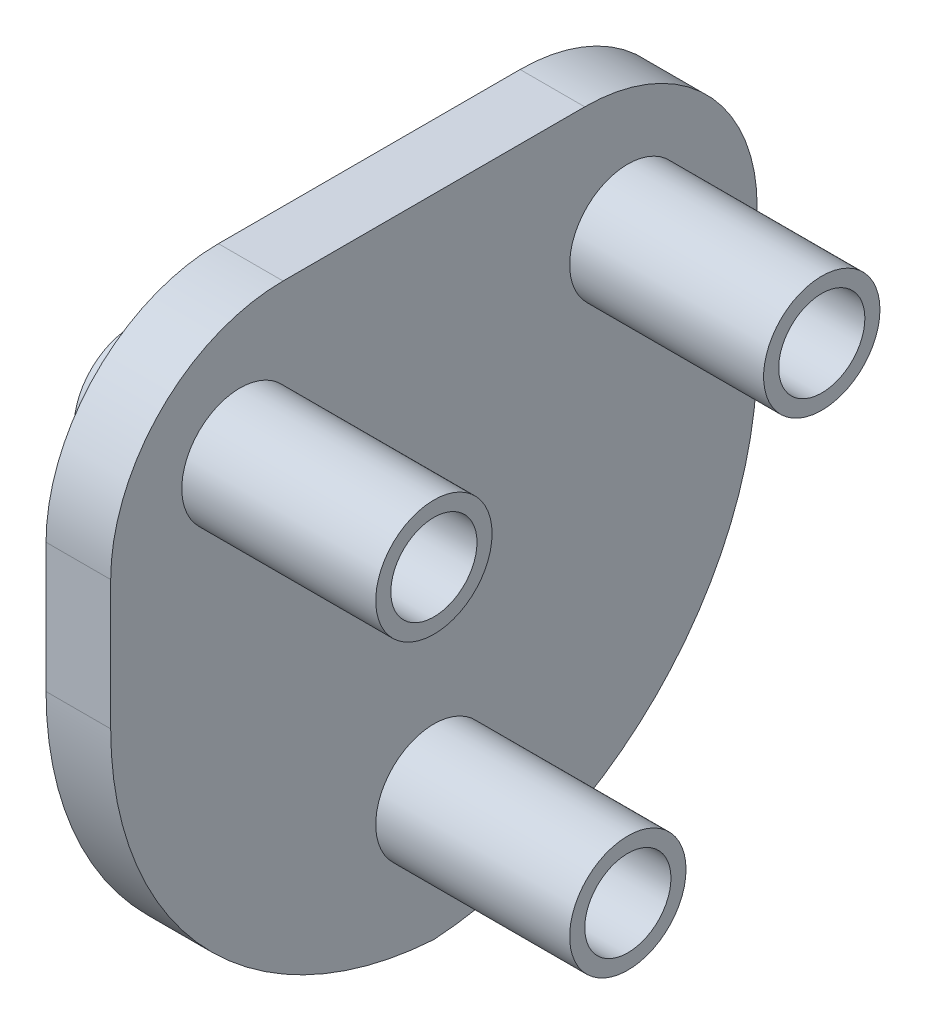
ISO-10303-21;
HEADER;
FILE_DESCRIPTION(('STEP AP214'),'2;1');
FILE_NAME('part.step','',(''),(''),'','','');
FILE_SCHEMA(('AUTOMOTIVE_DESIGN { 1 0 10303 214 1 1 1 1 }'));
ENDSEC;
DATA;
#1=APPLICATION_CONTEXT('core data for automotive mechanical design processes');
#2=APPLICATION_PROTOCOL_DEFINITION('international standard','automotive_design',2000,#1);
#3=PRODUCT_CONTEXT('',#1,'mechanical');
#4=PRODUCT('Part','Part','',(#3));
#5=PRODUCT_RELATED_PRODUCT_CATEGORY('part','',(#4));
#6=PRODUCT_DEFINITION_FORMATION('','',#4);
#7=PRODUCT_DEFINITION_CONTEXT('part definition',#1,'design');
#8=PRODUCT_DEFINITION('design','',#6,#7);
#9=PRODUCT_DEFINITION_SHAPE('','',#8);
#10=(LENGTH_UNIT() NAMED_UNIT(*) SI_UNIT(.MILLI.,.METRE.));
#11=(NAMED_UNIT(*) PLANE_ANGLE_UNIT() SI_UNIT($,.RADIAN.));
#12=(NAMED_UNIT(*) SI_UNIT($,.STERADIAN.) SOLID_ANGLE_UNIT());
#13=UNCERTAINTY_MEASURE_WITH_UNIT(LENGTH_MEASURE(1.E-05),#10,'distance_accuracy_value','');
#14=(GEOMETRIC_REPRESENTATION_CONTEXT(3) GLOBAL_UNCERTAINTY_ASSIGNED_CONTEXT((#13)) GLOBAL_UNIT_ASSIGNED_CONTEXT((#10,
#11,#12)) REPRESENTATION_CONTEXT('',''));
#15=CARTESIAN_POINT('',(0.,0.,0.));
#16=DIRECTION('',(0.,0.,1.));
#17=DIRECTION('',(1.,0.,0.));
#18=AXIS2_PLACEMENT_3D('',#15,#16,#17);
#19=CARTESIAN_POINT('',(-7.5,-75.,-75.));
#20=DIRECTION('',(-1.,0.,0.));
#21=DIRECTION('',(0.,0.,1.));
#22=AXIS2_PLACEMENT_3D('',#19,#20,#21);
#23=PLANE('',#22);
#24=CARTESIAN_POINT('',(-7.5,45.,-45.));
#25=DIRECTION('',(-1.,0.,0.));
#26=DIRECTION('',(0.,0.,1.));
#27=AXIS2_PLACEMENT_3D('',#24,#25,#26);
#28=CIRCLE('',#27,13.5);
#29=CARTESIAN_POINT('',(-7.5,45.,-31.5));
#30=VERTEX_POINT('',#29);
#31=EDGE_CURVE('E128',#30,#30,#28,.T.);
#32=ORIENTED_EDGE('',*,*,#31,.F.);
#33=EDGE_LOOP('',(#32));
#34=FACE_BOUND('',#33,.T.);
#35=CARTESIAN_POINT('',(-7.5,45.,45.));
#36=DIRECTION('',(-1.,0.,0.));
#37=DIRECTION('',(0.,0.,1.));
#38=AXIS2_PLACEMENT_3D('',#35,#36,#37);
#39=CIRCLE('',#38,13.5);
#40=CARTESIAN_POINT('',(-7.5,45.,58.5));
#41=VERTEX_POINT('',#40);
#42=EDGE_CURVE('E201',#41,#41,#39,.T.);
#43=ORIENTED_EDGE('',*,*,#42,.F.);
#44=EDGE_LOOP('',(#43));
#45=FACE_BOUND('',#44,.T.);
#46=CARTESIAN_POINT('',(-7.5,-45.,0.));
#47=DIRECTION('',(-1.,0.,0.));
#48=DIRECTION('',(0.,0.,1.));
#49=AXIS2_PLACEMENT_3D('',#46,#47,#48);
#50=CIRCLE('',#49,13.5);
#51=CARTESIAN_POINT('',(-7.5,-45.,13.5));
#52=VERTEX_POINT('',#51);
#53=EDGE_CURVE('E197',#52,#52,#50,.T.);
#54=ORIENTED_EDGE('',*,*,#53,.F.);
#55=EDGE_LOOP('',(#54));
#56=FACE_BOUND('',#55,.T.);
#57=DIRECTION('',(0.,0.,1.));
#58=VECTOR('',#57,1.);
#59=CARTESIAN_POINT('',(-7.5,75.,-75.));
#60=LINE('',#59,#58);
#61=CARTESIAN_POINT('',(-7.5,75.,-35.));
#62=VERTEX_POINT('',#61);
#63=CARTESIAN_POINT('',(-7.5,75.,35.));
#64=VERTEX_POINT('',#63);
#65=EDGE_CURVE('E179',#62,#64,#60,.T.);
#66=ORIENTED_EDGE('',*,*,#65,.F.);
#67=CARTESIAN_POINT('',(-7.5,35.,-35.));
#68=DIRECTION('',(-1.,0.,0.));
#69=DIRECTION('',(0.,0.,1.));
#70=AXIS2_PLACEMENT_3D('',#67,#68,#69);
#71=CIRCLE('',#70,40.);
#72=CARTESIAN_POINT('',(-7.5,35.,-75.));
#73=VERTEX_POINT('',#72);
#74=EDGE_CURVE('E160',#62,#73,#71,.T.);
#75=ORIENTED_EDGE('',*,*,#74,.T.);
#76=DIRECTION('',(0.,-1.,0.));
#77=VECTOR('',#76,1.);
#78=CARTESIAN_POINT('',(-7.5,-75.,-75.));
#79=LINE('',#78,#77);
#80=CARTESIAN_POINT('',(-7.5,5.,-75.));
#81=VERTEX_POINT('',#80);
#82=EDGE_CURVE('E120',#73,#81,#79,.T.);
#83=ORIENTED_EDGE('',*,*,#82,.T.);
#84=CARTESIAN_POINT('',(-7.5,5.,5.));
#85=DIRECTION('',(-1.,0.,0.));
#86=DIRECTION('',(0.,0.,1.));
#87=AXIS2_PLACEMENT_3D('',#84,#85,#86);
#88=CIRCLE('',#87,80.);
#89=CARTESIAN_POINT('',(-7.5,-74.8435971133566,0.));
#90=VERTEX_POINT('',#89);
#91=EDGE_CURVE('E114',#81,#90,#88,.T.);
#92=ORIENTED_EDGE('',*,*,#91,.T.);
#93=CARTESIAN_POINT('',(-7.5,5.,-5.));
#94=DIRECTION('',(-1.,0.,0.));
#95=DIRECTION('',(0.,0.,1.));
#96=AXIS2_PLACEMENT_3D('',#93,#94,#95);
#97=CIRCLE('',#96,80.);
#98=CARTESIAN_POINT('',(-7.5,5.,75.));
#99=VERTEX_POINT('',#98);
#100=EDGE_CURVE('E143',#90,#99,#97,.T.);
#101=ORIENTED_EDGE('',*,*,#100,.T.);
#102=DIRECTION('',(0.,-1.,0.));
#103=VECTOR('',#102,1.);
#104=CARTESIAN_POINT('',(-7.5,-75.,75.));
#105=LINE('',#104,#103);
#106=CARTESIAN_POINT('',(-7.5,35.,75.));
#107=VERTEX_POINT('',#106);
#108=EDGE_CURVE('E107',#107,#99,#105,.T.);
#109=ORIENTED_EDGE('',*,*,#108,.F.);
#110=CARTESIAN_POINT('',(-7.5,35.,35.));
#111=DIRECTION('',(-1.,0.,0.));
#112=DIRECTION('',(0.,0.,1.));
#113=AXIS2_PLACEMENT_3D('',#110,#111,#112);
#114=CIRCLE('',#113,40.);
#115=EDGE_CURVE('E157',#107,#64,#114,.T.);
#116=ORIENTED_EDGE('',*,*,#115,.T.);
#117=EDGE_LOOP('',(#66,#75,#83,#92,#101,#109,#116));
#118=FACE_BOUND('',#117,.T.);
#119=ADVANCED_FACE('F39',(#34,#45,#56,#118),#23,.T.);
#120=CARTESIAN_POINT('',(7.5,75.,-75.));
#121=DIRECTION('',(0.,1.,0.));
#122=DIRECTION('',(0.,0.,1.));
#123=AXIS2_PLACEMENT_3D('',#120,#121,#122);
#124=PLANE('',#123);
#125=DIRECTION('',(0.,0.,1.));
#126=VECTOR('',#125,1.);
#127=CARTESIAN_POINT('',(7.5,75.,-75.));
#128=LINE('',#127,#126);
#129=CARTESIAN_POINT('',(7.5,75.,-35.));
#130=VERTEX_POINT('',#129);
#131=CARTESIAN_POINT('',(7.5,75.,35.));
#132=VERTEX_POINT('',#131);
#133=EDGE_CURVE('E169',#130,#132,#128,.T.);
#134=ORIENTED_EDGE('',*,*,#133,.F.);
#135=DIRECTION('',(-1.,0.,0.));
#136=VECTOR('',#135,1.);
#137=CARTESIAN_POINT('',(-7.5,75.,-35.));
#138=LINE('',#137,#136);
#139=EDGE_CURVE('E153',#130,#62,#138,.T.);
#140=ORIENTED_EDGE('',*,*,#139,.T.);
#141=ORIENTED_EDGE('',*,*,#65,.T.);
#142=DIRECTION('',(-1.,0.,0.));
#143=VECTOR('',#142,1.);
#144=CARTESIAN_POINT('',(7.5,75.,35.));
#145=LINE('',#144,#143);
#146=EDGE_CURVE('E113',#64,#132,#145,.F.);
#147=ORIENTED_EDGE('',*,*,#146,.T.);
#148=EDGE_LOOP('',(#134,#140,#141,#147));
#149=FACE_BOUND('',#148,.T.);
#150=ADVANCED_FACE('F174',(#149),#124,.T.);
#151=CARTESIAN_POINT('',(7.5,-75.,-75.));
#152=DIRECTION('',(1.,0.,0.));
#153=DIRECTION('',(0.,0.,-1.));
#154=AXIS2_PLACEMENT_3D('',#151,#152,#153);
#155=PLANE('',#154);
#156=CARTESIAN_POINT('',(7.5,45.,-45.));
#157=DIRECTION('',(1.,0.,0.));
#158=DIRECTION('',(0.,0.,-1.));
#159=AXIS2_PLACEMENT_3D('',#156,#157,#158);
#160=CIRCLE('',#159,13.5);
#161=CARTESIAN_POINT('',(7.5,45.,-58.5));
#162=VERTEX_POINT('',#161);
#163=EDGE_CURVE('E135',#162,#162,#160,.T.);
#164=ORIENTED_EDGE('',*,*,#163,.F.);
#165=EDGE_LOOP('',(#164));
#166=FACE_BOUND('',#165,.T.);
#167=CARTESIAN_POINT('',(7.5,45.,45.));
#168=DIRECTION('',(1.,0.,0.));
#169=DIRECTION('',(0.,0.,-1.));
#170=AXIS2_PLACEMENT_3D('',#167,#168,#169);
#171=CIRCLE('',#170,13.5);
#172=CARTESIAN_POINT('',(7.5,45.,31.5));
#173=VERTEX_POINT('',#172);
#174=EDGE_CURVE('E198',#173,#173,#171,.T.);
#175=ORIENTED_EDGE('',*,*,#174,.F.);
#176=EDGE_LOOP('',(#175));
#177=FACE_BOUND('',#176,.T.);
#178=CARTESIAN_POINT('',(7.5,-45.,0.));
#179=DIRECTION('',(1.,0.,0.));
#180=DIRECTION('',(0.,0.,-1.));
#181=AXIS2_PLACEMENT_3D('',#178,#179,#180);
#182=CIRCLE('',#181,13.5);
#183=CARTESIAN_POINT('',(7.5,-45.,-13.5));
#184=VERTEX_POINT('',#183);
#185=EDGE_CURVE('E193',#184,#184,#182,.T.);
#186=ORIENTED_EDGE('',*,*,#185,.F.);
#187=EDGE_LOOP('',(#186));
#188=FACE_BOUND('',#187,.T.);
#189=DIRECTION('',(0.,1.,0.));
#190=VECTOR('',#189,1.);
#191=CARTESIAN_POINT('',(7.5,-75.,-75.));
#192=LINE('',#191,#190);
#193=CARTESIAN_POINT('',(7.5,5.,-75.));
#194=VERTEX_POINT('',#193);
#195=CARTESIAN_POINT('',(7.5,35.,-75.));
#196=VERTEX_POINT('',#195);
#197=EDGE_CURVE('E170',#194,#196,#192,.T.);
#198=ORIENTED_EDGE('',*,*,#197,.T.);
#199=CARTESIAN_POINT('',(7.5,35.,-35.));
#200=DIRECTION('',(1.,0.,0.));
#201=DIRECTION('',(0.,0.,-1.));
#202=AXIS2_PLACEMENT_3D('',#199,#200,#201);
#203=CIRCLE('',#202,40.);
#204=EDGE_CURVE('E48',#196,#130,#203,.T.);
#205=ORIENTED_EDGE('',*,*,#204,.T.);
#206=ORIENTED_EDGE('',*,*,#133,.T.);
#207=CARTESIAN_POINT('',(7.5,35.,35.));
#208=DIRECTION('',(1.,0.,0.));
#209=DIRECTION('',(0.,0.,-1.));
#210=AXIS2_PLACEMENT_3D('',#207,#208,#209);
#211=CIRCLE('',#210,40.);
#212=CARTESIAN_POINT('',(7.5,35.,75.));
#213=VERTEX_POINT('',#212);
#214=EDGE_CURVE('E55',#132,#213,#211,.T.);
#215=ORIENTED_EDGE('',*,*,#214,.T.);
#216=DIRECTION('',(0.,1.,0.));
#217=VECTOR('',#216,1.);
#218=CARTESIAN_POINT('',(7.5,-75.,75.));
#219=LINE('',#218,#217);
#220=CARTESIAN_POINT('',(7.5,5.,75.));
#221=VERTEX_POINT('',#220);
#222=EDGE_CURVE('E104',#221,#213,#219,.T.);
#223=ORIENTED_EDGE('',*,*,#222,.F.);
#224=CARTESIAN_POINT('',(7.5,5.,-5.));
#225=DIRECTION('',(1.,0.,0.));
#226=DIRECTION('',(0.,0.,-1.));
#227=AXIS2_PLACEMENT_3D('',#224,#225,#226);
#228=CIRCLE('',#227,80.);
#229=CARTESIAN_POINT('',(7.5,-74.8435971133566,0.));
#230=VERTEX_POINT('',#229);
#231=EDGE_CURVE('E117',#221,#230,#228,.T.);
#232=ORIENTED_EDGE('',*,*,#231,.T.);
#233=CARTESIAN_POINT('',(7.5,5.,5.));
#234=DIRECTION('',(1.,0.,0.));
#235=DIRECTION('',(0.,0.,-1.));
#236=AXIS2_PLACEMENT_3D('',#233,#234,#235);
#237=CIRCLE('',#236,80.);
#238=EDGE_CURVE('E127',#230,#194,#237,.T.);
#239=ORIENTED_EDGE('',*,*,#238,.T.);
#240=EDGE_LOOP('',(#198,#205,#206,#215,#223,#232,#239));
#241=FACE_BOUND('',#240,.T.);
#242=ADVANCED_FACE('F116',(#166,#177,#188,#241),#155,.T.);
#243=CARTESIAN_POINT('',(0.,0.,-75.));
#244=DIRECTION('',(0.,0.,1.));
#245=DIRECTION('',(1.,0.,0.));
#246=AXIS2_PLACEMENT_3D('',#243,#244,#245);
#247=PLANE('',#246);
#248=ORIENTED_EDGE('',*,*,#82,.F.);
#249=DIRECTION('',(-1.,0.,0.));
#250=VECTOR('',#249,1.);
#251=CARTESIAN_POINT('',(7.5,35.,-75.));
#252=LINE('',#251,#250);
#253=EDGE_CURVE('E63',#73,#196,#252,.F.);
#254=ORIENTED_EDGE('',*,*,#253,.T.);
#255=ORIENTED_EDGE('',*,*,#197,.F.);
#256=DIRECTION('',(1.,0.,0.));
#257=VECTOR('',#256,1.);
#258=CARTESIAN_POINT('',(-7.5,5.,-75.));
#259=LINE('',#258,#257);
#260=EDGE_CURVE('E132',#194,#81,#259,.F.);
#261=ORIENTED_EDGE('',*,*,#260,.T.);
#262=EDGE_LOOP('',(#248,#254,#255,#261));
#263=FACE_BOUND('',#262,.T.);
#264=ADVANCED_FACE('F184',(#263),#247,.F.);
#265=CARTESIAN_POINT('',(0.,0.,75.));
#266=DIRECTION('',(0.,0.,1.));
#267=DIRECTION('',(1.,0.,0.));
#268=AXIS2_PLACEMENT_3D('',#265,#266,#267);
#269=PLANE('',#268);
#270=ORIENTED_EDGE('',*,*,#222,.T.);
#271=DIRECTION('',(-1.,0.,0.));
#272=VECTOR('',#271,1.);
#273=CARTESIAN_POINT('',(0.,35.,75.));
#274=LINE('',#273,#272);
#275=EDGE_CURVE('E11',#213,#107,#274,.T.);
#276=ORIENTED_EDGE('',*,*,#275,.T.);
#277=ORIENTED_EDGE('',*,*,#108,.T.);
#278=DIRECTION('',(1.,0.,0.));
#279=VECTOR('',#278,1.);
#280=CARTESIAN_POINT('',(0.,5.,75.));
#281=LINE('',#280,#279);
#282=EDGE_CURVE('E102',#99,#221,#281,.T.);
#283=ORIENTED_EDGE('',*,*,#282,.T.);
#284=EDGE_LOOP('',(#270,#276,#277,#283));
#285=FACE_BOUND('',#284,.T.);
#286=ADVANCED_FACE('F103',(#285),#269,.T.);
#287=CARTESIAN_POINT('',(52.5,-45.,0.));
#288=DIRECTION('',(1.,0.,0.));
#289=DIRECTION('',(0.,0.,-1.));
#290=AXIS2_PLACEMENT_3D('',#287,#288,#289);
#291=PLANE('',#290);
#292=CARTESIAN_POINT('',(52.5,-45.,0.));
#293=DIRECTION('',(1.,0.,0.));
#294=DIRECTION('',(0.,0.,-1.));
#295=AXIS2_PLACEMENT_3D('',#292,#293,#294);
#296=CIRCLE('',#295,9.99999999999999);
#297=CARTESIAN_POINT('',(52.5,-45.,-9.99999999999999));
#298=VERTEX_POINT('',#297);
#299=EDGE_CURVE('E246',#298,#298,#296,.T.);
#300=ORIENTED_EDGE('',*,*,#299,.F.);
#301=EDGE_LOOP('',(#300));
#302=FACE_BOUND('',#301,.T.);
#303=CARTESIAN_POINT('',(52.5,-45.,0.));
#304=DIRECTION('',(1.,0.,0.));
#305=DIRECTION('',(0.,0.,-1.));
#306=AXIS2_PLACEMENT_3D('',#303,#304,#305);
#307=CIRCLE('',#306,13.5);
#308=CARTESIAN_POINT('',(52.5,-45.,-13.5));
#309=VERTEX_POINT('',#308);
#310=EDGE_CURVE('E218',#309,#309,#307,.T.);
#311=ORIENTED_EDGE('',*,*,#310,.T.);
#312=EDGE_LOOP('',(#311));
#313=FACE_BOUND('',#312,.T.);
#314=ADVANCED_FACE('F323',(#302,#313),#291,.T.);
#315=CARTESIAN_POINT('',(-17.5,-45.,0.));
#316=DIRECTION('',(1.,0.,0.));
#317=DIRECTION('',(0.,0.,-1.));
#318=AXIS2_PLACEMENT_3D('',#315,#316,#317);
#319=CYLINDRICAL_SURFACE('',#318,13.5);
#320=ORIENTED_EDGE('',*,*,#185,.T.);
#321=EDGE_LOOP('',(#320));
#322=FACE_BOUND('',#321,.T.);
#323=ORIENTED_EDGE('',*,*,#310,.F.);
#324=EDGE_LOOP('',(#323));
#325=FACE_BOUND('',#324,.T.);
#326=ADVANCED_FACE('F452',(#322,#325),#319,.T.);
#327=ORIENTED_EDGE('',*,*,#53,.T.);
#328=EDGE_LOOP('',(#327));
#329=FACE_BOUND('',#328,.T.);
#330=CARTESIAN_POINT('',(-17.5,-45.,0.));
#331=DIRECTION('',(1.,0.,0.));
#332=DIRECTION('',(0.,0.,-1.));
#333=AXIS2_PLACEMENT_3D('',#330,#331,#332);
#334=CIRCLE('',#333,13.5);
#335=CARTESIAN_POINT('',(-17.5,-45.,-13.5));
#336=VERTEX_POINT('',#335);
#337=EDGE_CURVE('E213',#336,#336,#334,.T.);
#338=ORIENTED_EDGE('',*,*,#337,.T.);
#339=EDGE_LOOP('',(#338));
#340=FACE_BOUND('',#339,.T.);
#341=ADVANCED_FACE('F442',(#329,#340),#319,.T.);
#342=CARTESIAN_POINT('',(-17.5,-45.,0.));
#343=DIRECTION('',(1.,0.,0.));
#344=DIRECTION('',(0.,0.,-1.));
#345=AXIS2_PLACEMENT_3D('',#342,#343,#344);
#346=PLANE('',#345);
#347=CARTESIAN_POINT('',(-17.5,-45.,0.));
#348=DIRECTION('',(1.,0.,0.));
#349=DIRECTION('',(0.,0.,-1.));
#350=AXIS2_PLACEMENT_3D('',#347,#348,#349);
#351=CIRCLE('',#350,9.99999999999999);
#352=CARTESIAN_POINT('',(-17.5,-45.,-9.99999999999999));
#353=VERTEX_POINT('',#352);
#354=EDGE_CURVE('E242',#353,#353,#351,.T.);
#355=ORIENTED_EDGE('',*,*,#354,.T.);
#356=EDGE_LOOP('',(#355));
#357=FACE_BOUND('',#356,.T.);
#358=ORIENTED_EDGE('',*,*,#337,.F.);
#359=EDGE_LOOP('',(#358));
#360=FACE_BOUND('',#359,.T.);
#361=ADVANCED_FACE('F272',(#357,#360),#346,.F.);
#362=CARTESIAN_POINT('',(52.5,45.,45.));
#363=DIRECTION('',(1.,0.,0.));
#364=DIRECTION('',(0.,0.,-1.));
#365=AXIS2_PLACEMENT_3D('',#362,#363,#364);
#366=PLANE('',#365);
#367=CARTESIAN_POINT('',(52.5,45.,45.));
#368=DIRECTION('',(1.,0.,0.));
#369=DIRECTION('',(0.,0.,-1.));
#370=AXIS2_PLACEMENT_3D('',#367,#368,#369);
#371=CIRCLE('',#370,9.99999999999999);
#372=CARTESIAN_POINT('',(52.5,45.,35.));
#373=VERTEX_POINT('',#372);
#374=EDGE_CURVE('E150',#373,#373,#371,.T.);
#375=ORIENTED_EDGE('',*,*,#374,.F.);
#376=EDGE_LOOP('',(#375));
#377=FACE_BOUND('',#376,.T.);
#378=CARTESIAN_POINT('',(52.5,45.,45.));
#379=DIRECTION('',(1.,0.,0.));
#380=DIRECTION('',(0.,0.,-1.));
#381=AXIS2_PLACEMENT_3D('',#378,#379,#380);
#382=CIRCLE('',#381,13.5);
#383=CARTESIAN_POINT('',(52.5,45.,31.5));
#384=VERTEX_POINT('',#383);
#385=EDGE_CURVE('E228',#384,#384,#382,.T.);
#386=ORIENTED_EDGE('',*,*,#385,.T.);
#387=EDGE_LOOP('',(#386));
#388=FACE_BOUND('',#387,.T.);
#389=ADVANCED_FACE('F268',(#377,#388),#366,.T.);
#390=CARTESIAN_POINT('',(-17.5,45.,45.));
#391=DIRECTION('',(1.,0.,0.));
#392=DIRECTION('',(0.,0.,-1.));
#393=AXIS2_PLACEMENT_3D('',#390,#391,#392);
#394=CYLINDRICAL_SURFACE('',#393,13.5);
#395=ORIENTED_EDGE('',*,*,#174,.T.);
#396=EDGE_LOOP('',(#395));
#397=FACE_BOUND('',#396,.T.);
#398=ORIENTED_EDGE('',*,*,#385,.F.);
#399=EDGE_LOOP('',(#398));
#400=FACE_BOUND('',#399,.T.);
#401=ADVANCED_FACE('F271',(#397,#400),#394,.T.);
#402=ORIENTED_EDGE('',*,*,#42,.T.);
#403=EDGE_LOOP('',(#402));
#404=FACE_BOUND('',#403,.T.);
#405=CARTESIAN_POINT('',(-17.5,45.,45.));
#406=DIRECTION('',(1.,0.,0.));
#407=DIRECTION('',(0.,0.,-1.));
#408=AXIS2_PLACEMENT_3D('',#405,#406,#407);
#409=CIRCLE('',#408,13.5);
#410=CARTESIAN_POINT('',(-17.5,45.,31.5));
#411=VERTEX_POINT('',#410);
#412=EDGE_CURVE('E223',#411,#411,#409,.T.);
#413=ORIENTED_EDGE('',*,*,#412,.T.);
#414=EDGE_LOOP('',(#413));
#415=FACE_BOUND('',#414,.T.);
#416=ADVANCED_FACE('F277',(#404,#415),#394,.T.);
#417=CARTESIAN_POINT('',(-17.5,45.,45.));
#418=DIRECTION('',(1.,0.,0.));
#419=DIRECTION('',(0.,0.,-1.));
#420=AXIS2_PLACEMENT_3D('',#417,#418,#419);
#421=PLANE('',#420);
#422=CARTESIAN_POINT('',(-17.5,45.,45.));
#423=DIRECTION('',(1.,0.,0.));
#424=DIRECTION('',(0.,0.,-1.));
#425=AXIS2_PLACEMENT_3D('',#422,#423,#424);
#426=CIRCLE('',#425,9.99999999999999);
#427=CARTESIAN_POINT('',(-17.5,45.,35.));
#428=VERTEX_POINT('',#427);
#429=EDGE_CURVE('E258',#428,#428,#426,.T.);
#430=ORIENTED_EDGE('',*,*,#429,.T.);
#431=EDGE_LOOP('',(#430));
#432=FACE_BOUND('',#431,.T.);
#433=ORIENTED_EDGE('',*,*,#412,.F.);
#434=EDGE_LOOP('',(#433));
#435=FACE_BOUND('',#434,.T.);
#436=ADVANCED_FACE('F282',(#432,#435),#421,.F.);
#437=CARTESIAN_POINT('',(52.5,45.,-45.));
#438=DIRECTION('',(1.,0.,0.));
#439=DIRECTION('',(0.,0.,-1.));
#440=AXIS2_PLACEMENT_3D('',#437,#438,#439);
#441=PLANE('',#440);
#442=CARTESIAN_POINT('',(52.5,45.,-45.));
#443=DIRECTION('',(1.,0.,0.));
#444=DIRECTION('',(0.,0.,-1.));
#445=AXIS2_PLACEMENT_3D('',#442,#443,#444);
#446=CIRCLE('',#445,9.99999999999999);
#447=CARTESIAN_POINT('',(52.5,45.,-55.));
#448=VERTEX_POINT('',#447);
#449=EDGE_CURVE('E254',#448,#448,#446,.T.);
#450=ORIENTED_EDGE('',*,*,#449,.F.);
#451=EDGE_LOOP('',(#450));
#452=FACE_BOUND('',#451,.T.);
#453=CARTESIAN_POINT('',(52.5,45.,-45.));
#454=DIRECTION('',(1.,0.,0.));
#455=DIRECTION('',(0.,0.,-1.));
#456=AXIS2_PLACEMENT_3D('',#453,#454,#455);
#457=CIRCLE('',#456,13.5);
#458=CARTESIAN_POINT('',(52.5,45.,-58.5));
#459=VERTEX_POINT('',#458);
#460=EDGE_CURVE('E238',#459,#459,#457,.T.);
#461=ORIENTED_EDGE('',*,*,#460,.T.);
#462=EDGE_LOOP('',(#461));
#463=FACE_BOUND('',#462,.T.);
#464=ADVANCED_FACE('F409',(#452,#463),#441,.T.);
#465=CARTESIAN_POINT('',(-17.5,45.,-45.));
#466=DIRECTION('',(1.,0.,0.));
#467=DIRECTION('',(0.,0.,-1.));
#468=AXIS2_PLACEMENT_3D('',#465,#466,#467);
#469=CYLINDRICAL_SURFACE('',#468,13.5);
#470=ORIENTED_EDGE('',*,*,#163,.T.);
#471=EDGE_LOOP('',(#470));
#472=FACE_BOUND('',#471,.T.);
#473=ORIENTED_EDGE('',*,*,#460,.F.);
#474=EDGE_LOOP('',(#473));
#475=FACE_BOUND('',#474,.T.);
#476=ADVANCED_FACE('F414',(#472,#475),#469,.T.);
#477=ORIENTED_EDGE('',*,*,#31,.T.);
#478=EDGE_LOOP('',(#477));
#479=FACE_BOUND('',#478,.T.);
#480=CARTESIAN_POINT('',(-17.5,45.,-45.));
#481=DIRECTION('',(1.,0.,0.));
#482=DIRECTION('',(0.,0.,-1.));
#483=AXIS2_PLACEMENT_3D('',#480,#481,#482);
#484=CIRCLE('',#483,13.5);
#485=CARTESIAN_POINT('',(-17.5,45.,-58.5));
#486=VERTEX_POINT('',#485);
#487=EDGE_CURVE('E233',#486,#486,#484,.T.);
#488=ORIENTED_EDGE('',*,*,#487,.T.);
#489=EDGE_LOOP('',(#488));
#490=FACE_BOUND('',#489,.T.);
#491=ADVANCED_FACE('F401',(#479,#490),#469,.T.);
#492=CARTESIAN_POINT('',(-17.5,45.,-45.));
#493=DIRECTION('',(1.,0.,0.));
#494=DIRECTION('',(0.,0.,-1.));
#495=AXIS2_PLACEMENT_3D('',#492,#493,#494);
#496=PLANE('',#495);
#497=CARTESIAN_POINT('',(-17.5,45.,-45.));
#498=DIRECTION('',(1.,0.,0.));
#499=DIRECTION('',(0.,0.,-1.));
#500=AXIS2_PLACEMENT_3D('',#497,#498,#499);
#501=CIRCLE('',#500,9.99999999999999);
#502=CARTESIAN_POINT('',(-17.5,45.,-55.));
#503=VERTEX_POINT('',#502);
#504=EDGE_CURVE('E250',#503,#503,#501,.T.);
#505=ORIENTED_EDGE('',*,*,#504,.T.);
#506=EDGE_LOOP('',(#505));
#507=FACE_BOUND('',#506,.T.);
#508=ORIENTED_EDGE('',*,*,#487,.F.);
#509=EDGE_LOOP('',(#508));
#510=FACE_BOUND('',#509,.T.);
#511=ADVANCED_FACE('F391',(#507,#510),#496,.F.);
#512=CARTESIAN_POINT('',(52.5,-45.,0.));
#513=DIRECTION('',(1.,0.,0.));
#514=DIRECTION('',(0.,0.,-1.));
#515=AXIS2_PLACEMENT_3D('',#512,#513,#514);
#516=CYLINDRICAL_SURFACE('',#515,9.99999999999999);
#517=ORIENTED_EDGE('',*,*,#354,.F.);
#518=EDGE_LOOP('',(#517));
#519=FACE_BOUND('',#518,.T.);
#520=ORIENTED_EDGE('',*,*,#299,.T.);
#521=EDGE_LOOP('',(#520));
#522=FACE_BOUND('',#521,.T.);
#523=ADVANCED_FACE('F381',(#519,#522),#516,.F.);
#524=CARTESIAN_POINT('',(52.5,45.,-45.));
#525=DIRECTION('',(1.,0.,0.));
#526=DIRECTION('',(0.,0.,-1.));
#527=AXIS2_PLACEMENT_3D('',#524,#525,#526);
#528=CYLINDRICAL_SURFACE('',#527,9.99999999999999);
#529=ORIENTED_EDGE('',*,*,#504,.F.);
#530=EDGE_LOOP('',(#529));
#531=FACE_BOUND('',#530,.T.);
#532=ORIENTED_EDGE('',*,*,#449,.T.);
#533=EDGE_LOOP('',(#532));
#534=FACE_BOUND('',#533,.T.);
#535=ADVANCED_FACE('F371',(#531,#534),#528,.F.);
#536=CARTESIAN_POINT('',(52.5,45.,45.));
#537=DIRECTION('',(1.,0.,0.));
#538=DIRECTION('',(0.,0.,-1.));
#539=AXIS2_PLACEMENT_3D('',#536,#537,#538);
#540=CYLINDRICAL_SURFACE('',#539,9.99999999999999);
#541=ORIENTED_EDGE('',*,*,#429,.F.);
#542=EDGE_LOOP('',(#541));
#543=FACE_BOUND('',#542,.T.);
#544=ORIENTED_EDGE('',*,*,#374,.T.);
#545=EDGE_LOOP('',(#544));
#546=FACE_BOUND('',#545,.T.);
#547=ADVANCED_FACE('F266',(#543,#546),#540,.F.);
#548=CARTESIAN_POINT('',(0.,5.,-5.));
#549=DIRECTION('',(1.,0.,0.));
#550=DIRECTION('',(0.,0.,-1.));
#551=AXIS2_PLACEMENT_3D('',#548,#549,#550);
#552=CYLINDRICAL_SURFACE('',#551,80.);
#553=ORIENTED_EDGE('',*,*,#282,.F.);
#554=ORIENTED_EDGE('',*,*,#100,.F.);
#555=DIRECTION('',(1.,0.,0.));
#556=VECTOR('',#555,1.);
#557=CARTESIAN_POINT('',(0.,-74.8435971133566,0.));
#558=LINE('',#557,#556);
#559=EDGE_CURVE('E124',#230,#90,#558,.F.);
#560=ORIENTED_EDGE('',*,*,#559,.F.);
#561=ORIENTED_EDGE('',*,*,#231,.F.);
#562=EDGE_LOOP('',(#553,#554,#560,#561));
#563=FACE_BOUND('',#562,.T.);
#564=ADVANCED_FACE('F122',(#563),#552,.T.);
#565=CARTESIAN_POINT('',(7.5,5.,5.));
#566=DIRECTION('',(-1.,0.,0.));
#567=DIRECTION('',(0.,0.,1.));
#568=AXIS2_PLACEMENT_3D('',#565,#566,#567);
#569=CYLINDRICAL_SURFACE('',#568,80.);
#570=ORIENTED_EDGE('',*,*,#91,.F.);
#571=ORIENTED_EDGE('',*,*,#260,.F.);
#572=ORIENTED_EDGE('',*,*,#238,.F.);
#573=ORIENTED_EDGE('',*,*,#559,.T.);
#574=EDGE_LOOP('',(#570,#571,#572,#573));
#575=FACE_BOUND('',#574,.T.);
#576=ADVANCED_FACE('F297',(#575),#569,.T.);
#577=CARTESIAN_POINT('',(7.5,35.,-35.));
#578=DIRECTION('',(1.,0.,0.));
#579=DIRECTION('',(0.,0.,-1.));
#580=AXIS2_PLACEMENT_3D('',#577,#578,#579);
#581=CYLINDRICAL_SURFACE('',#580,40.);
#582=ORIENTED_EDGE('',*,*,#204,.F.);
#583=ORIENTED_EDGE('',*,*,#253,.F.);
#584=ORIENTED_EDGE('',*,*,#74,.F.);
#585=ORIENTED_EDGE('',*,*,#139,.F.);
#586=EDGE_LOOP('',(#582,#583,#584,#585));
#587=FACE_BOUND('',#586,.T.);
#588=ADVANCED_FACE('F181',(#587),#581,.T.);
#589=CARTESIAN_POINT('',(0.,35.,35.));
#590=DIRECTION('',(-1.,0.,0.));
#591=DIRECTION('',(0.,0.,1.));
#592=AXIS2_PLACEMENT_3D('',#589,#590,#591);
#593=CYLINDRICAL_SURFACE('',#592,40.);
#594=ORIENTED_EDGE('',*,*,#214,.F.);
#595=ORIENTED_EDGE('',*,*,#146,.F.);
#596=ORIENTED_EDGE('',*,*,#115,.F.);
#597=ORIENTED_EDGE('',*,*,#275,.F.);
#598=EDGE_LOOP('',(#594,#595,#596,#597));
#599=FACE_BOUND('',#598,.T.);
#600=ADVANCED_FACE('F41',(#599),#593,.T.);
#601=CLOSED_SHELL('',(#119,#150,#242,#264,#286,#314,#326,#341,#361,#389,#401,#416,#436,#464,
#476,#491,#511,#523,#535,#547,#564,#576,#588,#600));
#602=MANIFOLD_SOLID_BREP('B2',#601);
#603=ADVANCED_BREP_SHAPE_REPRESENTATION('',(#18,#602),#14);
#604=SHAPE_DEFINITION_REPRESENTATION(#9,#603);
ENDSEC;
END-ISO-10303-21;
